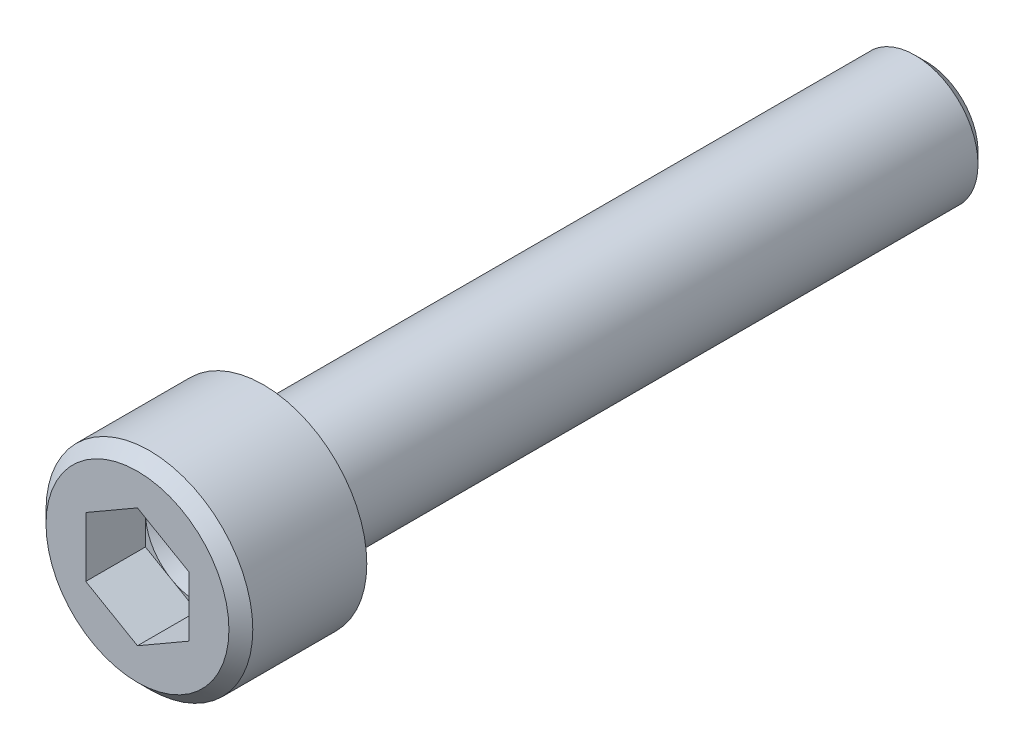
ISO-10303-21;
HEADER;
FILE_DESCRIPTION(('STEP AP214'),'2;1');
FILE_NAME('part.step','',(''),(''),'','','');
FILE_SCHEMA(('AUTOMOTIVE_DESIGN { 1 0 10303 214 1 1 1 1 }'));
ENDSEC;
DATA;
#1=APPLICATION_CONTEXT('core data for automotive mechanical design processes');
#2=APPLICATION_PROTOCOL_DEFINITION('international standard','automotive_design',2000,#1);
#3=PRODUCT_CONTEXT('',#1,'mechanical');
#4=PRODUCT('Part','Part','',(#3));
#5=PRODUCT_RELATED_PRODUCT_CATEGORY('part','',(#4));
#6=PRODUCT_DEFINITION_FORMATION('','',#4);
#7=PRODUCT_DEFINITION_CONTEXT('part definition',#1,'design');
#8=PRODUCT_DEFINITION('design','',#6,#7);
#9=PRODUCT_DEFINITION_SHAPE('','',#8);
#10=(LENGTH_UNIT() NAMED_UNIT(*) SI_UNIT(.MILLI.,.METRE.));
#11=(NAMED_UNIT(*) PLANE_ANGLE_UNIT() SI_UNIT($,.RADIAN.));
#12=(NAMED_UNIT(*) SI_UNIT($,.STERADIAN.) SOLID_ANGLE_UNIT());
#13=UNCERTAINTY_MEASURE_WITH_UNIT(LENGTH_MEASURE(1.E-05),#10,'distance_accuracy_value','');
#14=(GEOMETRIC_REPRESENTATION_CONTEXT(3) GLOBAL_UNCERTAINTY_ASSIGNED_CONTEXT((#13)) GLOBAL_UNIT_ASSIGNED_CONTEXT((#10,
#11,#12)) REPRESENTATION_CONTEXT('',''));
#15=CARTESIAN_POINT('',(0.,0.,0.));
#16=DIRECTION('',(0.,0.,1.));
#17=DIRECTION('',(1.,0.,0.));
#18=AXIS2_PLACEMENT_3D('',#15,#16,#17);
#19=CARTESIAN_POINT('',(0.,0.,2.54));
#20=DIRECTION('',(0.,0.,1.));
#21=DIRECTION('',(1.,0.,0.));
#22=AXIS2_PLACEMENT_3D('',#19,#20,#21);
#23=PLANE('',#22);
#24=DIRECTION('',(0.,1.,0.));
#25=VECTOR('',#24,1.);
#26=CARTESIAN_POINT('',(-1.9812,0.,2.54));
#27=LINE('',#26,#25);
#28=CARTESIAN_POINT('',(-1.9812,0.,2.54));
#29=VERTEX_POINT('',#28);
#30=CARTESIAN_POINT('',(-1.9812,1.14384635331848,2.54));
#31=VERTEX_POINT('',#30);
#32=EDGE_CURVE('E398',#29,#31,#27,.T.);
#33=ORIENTED_EDGE('',*,*,#32,.F.);
#34=CARTESIAN_POINT('',(0.,0.,2.54));
#35=DIRECTION('',(0.,0.,-1.));
#36=DIRECTION('',(-1.,0.,0.));
#37=AXIS2_PLACEMENT_3D('',#34,#35,#36);
#38=CIRCLE('',#37,1.9812);
#39=CARTESIAN_POINT('',(-0.9906,1.71576952997773,2.54));
#40=VERTEX_POINT('',#39);
#41=EDGE_CURVE('E33',#29,#40,#38,.T.);
#42=ORIENTED_EDGE('',*,*,#41,.T.);
#43=DIRECTION('',(0.866025403784439,0.5,0.));
#44=VECTOR('',#43,1.);
#45=CARTESIAN_POINT('',(0.163354175866616,2.38200528404682,2.54));
#46=LINE('',#45,#44);
#47=EDGE_CURVE('E393',#31,#40,#46,.T.);
#48=ORIENTED_EDGE('',*,*,#47,.F.);
#49=EDGE_LOOP('',(#33,#42,#48));
#50=FACE_BOUND('',#49,.T.);
#51=ADVANCED_FACE('F17',(#50),#23,.T.);
#52=CARTESIAN_POINT('',(0.,2.28769270663697,2.54));
#53=VERTEX_POINT('',#52);
#54=EDGE_CURVE('E391',#40,#53,#46,.T.);
#55=ORIENTED_EDGE('',*,*,#54,.F.);
#56=CARTESIAN_POINT('',(0.9906,1.71576952997773,2.54));
#57=VERTEX_POINT('',#56);
#58=EDGE_CURVE('E224',#40,#57,#38,.T.);
#59=ORIENTED_EDGE('',*,*,#58,.T.);
#60=DIRECTION('',(0.866025403784439,-0.5,0.));
#61=VECTOR('',#60,1.);
#62=CARTESIAN_POINT('',(-0.163354175866613,2.38200528404681,2.54));
#63=LINE('',#62,#61);
#64=EDGE_CURVE('E383',#53,#57,#63,.T.);
#65=ORIENTED_EDGE('',*,*,#64,.F.);
#66=EDGE_LOOP('',(#55,#59,#65));
#67=FACE_BOUND('',#66,.T.);
#68=ADVANCED_FACE('F105',(#67),#23,.T.);
#69=CARTESIAN_POINT('',(1.9812,1.14384635331849,2.54));
#70=VERTEX_POINT('',#69);
#71=EDGE_CURVE('E189',#57,#70,#63,.T.);
#72=ORIENTED_EDGE('',*,*,#71,.F.);
#73=CARTESIAN_POINT('',(1.9812,0.,2.54));
#74=VERTEX_POINT('',#73);
#75=EDGE_CURVE('E380',#57,#74,#38,.T.);
#76=ORIENTED_EDGE('',*,*,#75,.T.);
#77=DIRECTION('',(0.,-1.,0.));
#78=VECTOR('',#77,1.);
#79=CARTESIAN_POINT('',(1.9812,0.,2.54));
#80=LINE('',#79,#78);
#81=EDGE_CURVE('E160',#70,#74,#80,.T.);
#82=ORIENTED_EDGE('',*,*,#81,.F.);
#83=EDGE_LOOP('',(#72,#76,#82));
#84=FACE_BOUND('',#83,.T.);
#85=ADVANCED_FACE('F111',(#84),#23,.T.);
#86=CARTESIAN_POINT('',(1.9812,-1.14384635331849,2.54));
#87=VERTEX_POINT('',#86);
#88=EDGE_CURVE('E155',#74,#87,#80,.T.);
#89=ORIENTED_EDGE('',*,*,#88,.F.);
#90=CARTESIAN_POINT('',(0.9906,-1.71576952997773,2.54));
#91=VERTEX_POINT('',#90);
#92=EDGE_CURVE('E415',#74,#91,#38,.T.);
#93=ORIENTED_EDGE('',*,*,#92,.T.);
#94=DIRECTION('',(-0.866025403784438,-0.5,0.));
#95=VECTOR('',#94,1.);
#96=CARTESIAN_POINT('',(2.14455417586661,-1.04953377590865,2.54));
#97=LINE('',#96,#95);
#98=EDGE_CURVE('E148',#87,#91,#97,.T.);
#99=ORIENTED_EDGE('',*,*,#98,.F.);
#100=EDGE_LOOP('',(#89,#93,#99));
#101=FACE_BOUND('',#100,.T.);
#102=ADVANCED_FACE('F129',(#101),#23,.T.);
#103=CARTESIAN_POINT('',(0.,-2.28769270663697,2.54));
#104=VERTEX_POINT('',#103);
#105=EDGE_CURVE('E141',#91,#104,#97,.T.);
#106=ORIENTED_EDGE('',*,*,#105,.F.);
#107=CARTESIAN_POINT('',(-0.9906,-1.71576952997773,2.54));
#108=VERTEX_POINT('',#107);
#109=EDGE_CURVE('E143',#91,#108,#38,.T.);
#110=ORIENTED_EDGE('',*,*,#109,.T.);
#111=DIRECTION('',(-0.866025403784439,0.5,0.));
#112=VECTOR('',#111,1.);
#113=CARTESIAN_POINT('',(-2.14455417586661,-1.04953377590865,2.54));
#114=LINE('',#113,#112);
#115=EDGE_CURVE('E145',#104,#108,#114,.T.);
#116=ORIENTED_EDGE('',*,*,#115,.F.);
#117=EDGE_LOOP('',(#106,#110,#116));
#118=FACE_BOUND('',#117,.T.);
#119=ADVANCED_FACE('F119',(#118),#23,.T.);
#120=CARTESIAN_POINT('',(0.,0.,4.826));
#121=DIRECTION('',(0.,0.,1.));
#122=DIRECTION('',(1.,0.,0.));
#123=AXIS2_PLACEMENT_3D('',#120,#121,#122);
#124=PLANE('',#123);
#125=CARTESIAN_POINT('',(0.,0.,4.826));
#126=DIRECTION('',(0.,0.,1.));
#127=DIRECTION('',(1.,0.,0.));
#128=AXIS2_PLACEMENT_3D('',#125,#126,#127);
#129=CIRCLE('',#128,3.5052);
#130=CARTESIAN_POINT('',(3.5052,0.,4.826));
#131=VERTEX_POINT('',#130);
#132=EDGE_CURVE('E210',#131,#131,#129,.T.);
#133=ORIENTED_EDGE('',*,*,#132,.T.);
#134=EDGE_LOOP('',(#133));
#135=FACE_BOUND('',#134,.T.);
#136=DIRECTION('',(0.866025403784439,0.5,0.));
#137=VECTOR('',#136,1.);
#138=CARTESIAN_POINT('',(0.163354175866616,2.38200528404682,4.826));
#139=LINE('',#138,#137);
#140=CARTESIAN_POINT('',(-1.9812,1.14384635331848,4.826));
#141=VERTEX_POINT('',#140);
#142=CARTESIAN_POINT('',(0.,2.28769270663697,4.826));
#143=VERTEX_POINT('',#142);
#144=EDGE_CURVE('E172',#141,#143,#139,.T.);
#145=ORIENTED_EDGE('',*,*,#144,.T.);
#146=DIRECTION('',(0.866025403784439,-0.5,0.));
#147=VECTOR('',#146,1.);
#148=CARTESIAN_POINT('',(-0.163354175866613,2.38200528404681,4.826));
#149=LINE('',#148,#147);
#150=CARTESIAN_POINT('',(1.9812,1.14384635331849,4.826));
#151=VERTEX_POINT('',#150);
#152=EDGE_CURVE('E168',#143,#151,#149,.T.);
#153=ORIENTED_EDGE('',*,*,#152,.T.);
#154=DIRECTION('',(0.,-1.,0.));
#155=VECTOR('',#154,1.);
#156=CARTESIAN_POINT('',(1.9812,0.,4.826));
#157=LINE('',#156,#155);
#158=CARTESIAN_POINT('',(1.9812,-1.14384635331849,4.826));
#159=VERTEX_POINT('',#158);
#160=EDGE_CURVE('E185',#151,#159,#157,.T.);
#161=ORIENTED_EDGE('',*,*,#160,.T.);
#162=DIRECTION('',(-0.866025403784438,-0.5,0.));
#163=VECTOR('',#162,1.);
#164=CARTESIAN_POINT('',(2.14455417586661,-1.04953377590865,4.826));
#165=LINE('',#164,#163);
#166=CARTESIAN_POINT('',(0.,-2.28769270663697,4.826));
#167=VERTEX_POINT('',#166);
#168=EDGE_CURVE('E41',#159,#167,#165,.T.);
#169=ORIENTED_EDGE('',*,*,#168,.T.);
#170=DIRECTION('',(-0.866025403784439,0.5,0.));
#171=VECTOR('',#170,1.);
#172=CARTESIAN_POINT('',(-2.14455417586661,-1.04953377590865,4.826));
#173=LINE('',#172,#171);
#174=CARTESIAN_POINT('',(-1.9812,-1.14384635331849,4.826));
#175=VERTEX_POINT('',#174);
#176=EDGE_CURVE('E180',#167,#175,#173,.T.);
#177=ORIENTED_EDGE('',*,*,#176,.T.);
#178=DIRECTION('',(0.,1.,0.));
#179=VECTOR('',#178,1.);
#180=CARTESIAN_POINT('',(-1.9812,0.,4.826));
#181=LINE('',#180,#179);
#182=EDGE_CURVE('E176',#175,#141,#181,.T.);
#183=ORIENTED_EDGE('',*,*,#182,.T.);
#184=EDGE_LOOP('',(#145,#153,#161,#169,#177,#183));
#185=FACE_BOUND('',#184,.T.);
#186=ADVANCED_FACE('F128',(#135,#185),#124,.T.);
#187=CARTESIAN_POINT('',(0.,0.,4.826));
#188=DIRECTION('',(0.,0.,-1.));
#189=DIRECTION('',(-1.,0.,0.));
#190=AXIS2_PLACEMENT_3D('',#187,#188,#189);
#191=CYLINDRICAL_SURFACE('',#190,3.9624);
#192=CARTESIAN_POINT('',(0.,0.,4.3688));
#193=DIRECTION('',(0.,0.,1.));
#194=DIRECTION('',(1.,0.,0.));
#195=AXIS2_PLACEMENT_3D('',#192,#193,#194);
#196=CIRCLE('',#195,3.9624);
#197=CARTESIAN_POINT('',(3.9624,0.,4.3688));
#198=VERTEX_POINT('',#197);
#199=EDGE_CURVE('E214',#198,#198,#196,.F.);
#200=ORIENTED_EDGE('',*,*,#199,.T.);
#201=EDGE_LOOP('',(#200));
#202=FACE_BOUND('',#201,.T.);
#203=CARTESIAN_POINT('',(0.,0.,0.));
#204=DIRECTION('',(0.,0.,1.));
#205=DIRECTION('',(1.,0.,0.));
#206=AXIS2_PLACEMENT_3D('',#203,#204,#205);
#207=CIRCLE('',#206,3.9624);
#208=CARTESIAN_POINT('',(3.9624,0.,0.));
#209=VERTEX_POINT('',#208);
#210=EDGE_CURVE('E206',#209,#209,#207,.T.);
#211=ORIENTED_EDGE('',*,*,#210,.T.);
#212=EDGE_LOOP('',(#211));
#213=FACE_BOUND('',#212,.T.);
#214=ADVANCED_FACE('F134',(#202,#213),#191,.T.);
#215=CARTESIAN_POINT('',(0.,0.,0.));
#216=DIRECTION('',(0.,0.,1.));
#217=DIRECTION('',(1.,0.,0.));
#218=AXIS2_PLACEMENT_3D('',#215,#216,#217);
#219=PLANE('',#218);
#220=CARTESIAN_POINT('',(0.,0.,0.));
#221=DIRECTION('',(0.,0.,1.));
#222=DIRECTION('',(1.,0.,0.));
#223=AXIS2_PLACEMENT_3D('',#220,#221,#222);
#224=CIRCLE('',#223,2.5654);
#225=CARTESIAN_POINT('',(2.5654,0.,0.));
#226=VERTEX_POINT('',#225);
#227=EDGE_CURVE('E223',#226,#226,#224,.T.);
#228=ORIENTED_EDGE('',*,*,#227,.T.);
#229=EDGE_LOOP('',(#228));
#230=FACE_BOUND('',#229,.T.);
#231=ORIENTED_EDGE('',*,*,#210,.F.);
#232=EDGE_LOOP('',(#231));
#233=FACE_BOUND('',#232,.T.);
#234=ADVANCED_FACE('F324',(#230,#233),#219,.F.);
#235=CARTESIAN_POINT('',(0.,0.,4.826));
#236=DIRECTION('',(0.,0.,-1.));
#237=DIRECTION('',(-1.,0.,0.));
#238=AXIS2_PLACEMENT_3D('',#235,#236,#237);
#239=CONICAL_SURFACE('',#238,3.5052,0.785398163397449);
#240=ORIENTED_EDGE('',*,*,#199,.F.);
#241=EDGE_LOOP('',(#240));
#242=FACE_BOUND('',#241,.T.);
#243=ORIENTED_EDGE('',*,*,#132,.F.);
#244=EDGE_LOOP('',(#243));
#245=FACE_BOUND('',#244,.T.);
#246=ADVANCED_FACE('F315',(#242,#245),#239,.T.);
#247=CARTESIAN_POINT('',(-0.163354175866613,2.38200528404681,2.54));
#248=DIRECTION('',(-0.5,-0.866025403784439,0.));
#249=DIRECTION('',(0.866025403784439,-0.5,0.));
#250=AXIS2_PLACEMENT_3D('',#247,#248,#249);
#251=PLANE('',#250);
#252=ORIENTED_EDGE('',*,*,#152,.F.);
#253=DIRECTION('',(0.,0.,1.));
#254=VECTOR('',#253,1.);
#255=CARTESIAN_POINT('',(0.,2.28769270663697,2.54));
#256=LINE('',#255,#254);
#257=EDGE_CURVE('E203',#53,#143,#256,.T.);
#258=ORIENTED_EDGE('',*,*,#257,.F.);
#259=ORIENTED_EDGE('',*,*,#64,.T.);
#260=ORIENTED_EDGE('',*,*,#71,.T.);
#261=DIRECTION('',(0.,0.,1.));
#262=VECTOR('',#261,1.);
#263=CARTESIAN_POINT('',(1.9812,1.14384635331849,2.54));
#264=LINE('',#263,#262);
#265=EDGE_CURVE('E167',#70,#151,#264,.T.);
#266=ORIENTED_EDGE('',*,*,#265,.T.);
#267=EDGE_LOOP('',(#252,#258,#259,#260,#266));
#268=FACE_BOUND('',#267,.T.);
#269=ADVANCED_FACE('F306',(#268),#251,.T.);
#270=CARTESIAN_POINT('',(0.163354175866616,2.38200528404682,2.54));
#271=DIRECTION('',(0.5,-0.866025403784438,0.));
#272=DIRECTION('',(0.866025403784438,0.5,0.));
#273=AXIS2_PLACEMENT_3D('',#270,#271,#272);
#274=PLANE('',#273);
#275=ORIENTED_EDGE('',*,*,#144,.F.);
#276=DIRECTION('',(0.,0.,1.));
#277=VECTOR('',#276,1.);
#278=CARTESIAN_POINT('',(-1.9812,1.14384635331848,2.54));
#279=LINE('',#278,#277);
#280=EDGE_CURVE('E200',#31,#141,#279,.T.);
#281=ORIENTED_EDGE('',*,*,#280,.F.);
#282=ORIENTED_EDGE('',*,*,#47,.T.);
#283=ORIENTED_EDGE('',*,*,#54,.T.);
#284=ORIENTED_EDGE('',*,*,#257,.T.);
#285=EDGE_LOOP('',(#275,#281,#282,#283,#284));
#286=FACE_BOUND('',#285,.T.);
#287=ADVANCED_FACE('F297',(#286),#274,.T.);
#288=CARTESIAN_POINT('',(-1.9812,0.,2.54));
#289=DIRECTION('',(1.,0.,0.));
#290=DIRECTION('',(0.,1.,0.));
#291=AXIS2_PLACEMENT_3D('',#288,#289,#290);
#292=PLANE('',#291);
#293=ORIENTED_EDGE('',*,*,#182,.F.);
#294=DIRECTION('',(0.,0.,1.));
#295=VECTOR('',#294,1.);
#296=CARTESIAN_POINT('',(-1.9812,-1.14384635331849,2.54));
#297=LINE('',#296,#295);
#298=CARTESIAN_POINT('',(-1.9812,-1.14384635331849,2.54));
#299=VERTEX_POINT('',#298);
#300=EDGE_CURVE('E197',#299,#175,#297,.T.);
#301=ORIENTED_EDGE('',*,*,#300,.F.);
#302=EDGE_CURVE('E399',#299,#29,#27,.T.);
#303=ORIENTED_EDGE('',*,*,#302,.T.);
#304=ORIENTED_EDGE('',*,*,#32,.T.);
#305=ORIENTED_EDGE('',*,*,#280,.T.);
#306=EDGE_LOOP('',(#293,#301,#303,#304,#305));
#307=FACE_BOUND('',#306,.T.);
#308=ADVANCED_FACE('F288',(#307),#292,.T.);
#309=CARTESIAN_POINT('',(-2.14455417586661,-1.04953377590865,2.54));
#310=DIRECTION('',(0.5,0.866025403784439,0.));
#311=DIRECTION('',(-0.866025403784439,0.5,0.));
#312=AXIS2_PLACEMENT_3D('',#309,#310,#311);
#313=PLANE('',#312);
#314=ORIENTED_EDGE('',*,*,#176,.F.);
#315=DIRECTION('',(0.,0.,1.));
#316=VECTOR('',#315,1.);
#317=CARTESIAN_POINT('',(0.,-2.28769270663697,2.54));
#318=LINE('',#317,#316);
#319=EDGE_CURVE('E194',#104,#167,#318,.T.);
#320=ORIENTED_EDGE('',*,*,#319,.F.);
#321=ORIENTED_EDGE('',*,*,#115,.T.);
#322=EDGE_CURVE('E401',#108,#299,#114,.T.);
#323=ORIENTED_EDGE('',*,*,#322,.T.);
#324=ORIENTED_EDGE('',*,*,#300,.T.);
#325=EDGE_LOOP('',(#314,#320,#321,#323,#324));
#326=FACE_BOUND('',#325,.T.);
#327=ADVANCED_FACE('F280',(#326),#313,.T.);
#328=CARTESIAN_POINT('',(2.14455417586661,-1.04953377590865,2.54));
#329=DIRECTION('',(-0.5,0.866025403784438,0.));
#330=DIRECTION('',(-0.866025403784438,-0.5,0.));
#331=AXIS2_PLACEMENT_3D('',#328,#329,#330);
#332=PLANE('',#331);
#333=ORIENTED_EDGE('',*,*,#168,.F.);
#334=DIRECTION('',(0.,0.,1.));
#335=VECTOR('',#334,1.);
#336=CARTESIAN_POINT('',(1.9812,-1.14384635331849,2.54));
#337=LINE('',#336,#335);
#338=EDGE_CURVE('E151',#87,#159,#337,.T.);
#339=ORIENTED_EDGE('',*,*,#338,.F.);
#340=ORIENTED_EDGE('',*,*,#98,.T.);
#341=ORIENTED_EDGE('',*,*,#105,.T.);
#342=ORIENTED_EDGE('',*,*,#319,.T.);
#343=EDGE_LOOP('',(#333,#339,#340,#341,#342));
#344=FACE_BOUND('',#343,.T.);
#345=ADVANCED_FACE('F124',(#344),#332,.T.);
#346=CARTESIAN_POINT('',(1.9812,0.,2.54));
#347=DIRECTION('',(-1.,0.,0.));
#348=DIRECTION('',(0.,-1.,0.));
#349=AXIS2_PLACEMENT_3D('',#346,#347,#348);
#350=PLANE('',#349);
#351=ORIENTED_EDGE('',*,*,#160,.F.);
#352=ORIENTED_EDGE('',*,*,#265,.F.);
#353=ORIENTED_EDGE('',*,*,#81,.T.);
#354=ORIENTED_EDGE('',*,*,#88,.T.);
#355=ORIENTED_EDGE('',*,*,#338,.T.);
#356=EDGE_LOOP('',(#351,#352,#353,#354,#355));
#357=FACE_BOUND('',#356,.T.);
#358=ADVANCED_FACE('F117',(#357),#350,.T.);
#359=ORIENTED_EDGE('',*,*,#322,.F.);
#360=EDGE_CURVE('E218',#108,#29,#38,.T.);
#361=ORIENTED_EDGE('',*,*,#360,.T.);
#362=ORIENTED_EDGE('',*,*,#302,.F.);
#363=EDGE_LOOP('',(#359,#361,#362));
#364=FACE_BOUND('',#363,.T.);
#365=ADVANCED_FACE('F108',(#364),#23,.T.);
#366=CARTESIAN_POINT('',(0.,0.,-25.4));
#367=DIRECTION('',(0.,0.,1.));
#368=DIRECTION('',(1.,0.,0.));
#369=AXIS2_PLACEMENT_3D('',#366,#367,#368);
#370=CYLINDRICAL_SURFACE('',#369,2.413);
#371=CARTESIAN_POINT('',(0.,0.,-24.97105761938));
#372=DIRECTION('',(0.,0.,-1.));
#373=DIRECTION('',(-1.,0.,0.));
#374=AXIS2_PLACEMENT_3D('',#371,#372,#373);
#375=CIRCLE('',#374,2.413);
#376=CARTESIAN_POINT('',(-2.413,0.,-24.97105761938));
#377=VERTEX_POINT('',#376);
#378=EDGE_CURVE('E11',#377,#377,#375,.F.);
#379=ORIENTED_EDGE('',*,*,#378,.T.);
#380=EDGE_LOOP('',(#379));
#381=FACE_BOUND('',#380,.T.);
#382=CARTESIAN_POINT('',(0.,0.,-0.1524));
#383=DIRECTION('',(0.,0.,1.));
#384=DIRECTION('',(1.,0.,0.));
#385=AXIS2_PLACEMENT_3D('',#382,#383,#384);
#386=CIRCLE('',#385,2.413);
#387=CARTESIAN_POINT('',(2.413,0.,-0.1524));
#388=VERTEX_POINT('',#387);
#389=EDGE_CURVE('E219',#388,#388,#386,.F.);
#390=ORIENTED_EDGE('',*,*,#389,.T.);
#391=EDGE_LOOP('',(#390));
#392=FACE_BOUND('',#391,.T.);
#393=ADVANCED_FACE('F101',(#381,#392),#370,.T.);
#394=CARTESIAN_POINT('',(0.,0.,-25.4));
#395=DIRECTION('',(0.,0.,-1.));
#396=DIRECTION('',(1.,0.,0.));
#397=AXIS2_PLACEMENT_3D('',#394,#395,#396);
#398=PLANE('',#397);
#399=CARTESIAN_POINT('',(0.,0.,-25.4));
#400=DIRECTION('',(0.,0.,-1.));
#401=DIRECTION('',(-1.,0.,0.));
#402=AXIS2_PLACEMENT_3D('',#399,#400,#401);
#403=CIRCLE('',#402,1.98405761938);
#404=CARTESIAN_POINT('',(-1.98405761938,0.,-25.4));
#405=VERTEX_POINT('',#404);
#406=EDGE_CURVE('E26',#405,#405,#403,.T.);
#407=ORIENTED_EDGE('',*,*,#406,.T.);
#408=EDGE_LOOP('',(#407));
#409=FACE_BOUND('',#408,.T.);
#410=ADVANCED_FACE('F94',(#409),#398,.T.);
#411=CARTESIAN_POINT('',(0.,0.,1.39615364668151));
#412=DIRECTION('',(0.,0.,1.));
#413=DIRECTION('',(1.,0.,0.));
#414=AXIS2_PLACEMENT_3D('',#411,#412,#413);
#415=CONICAL_SURFACE('',#414,0.,1.0471975511966);
#416=ORIENTED_EDGE('',*,*,#41,.F.);
#417=ORIENTED_EDGE('',*,*,#360,.F.);
#418=ORIENTED_EDGE('',*,*,#109,.F.);
#419=ORIENTED_EDGE('',*,*,#92,.F.);
#420=ORIENTED_EDGE('',*,*,#75,.F.);
#421=ORIENTED_EDGE('',*,*,#58,.F.);
#422=EDGE_LOOP('',(#416,#417,#418,#419,#420,#421));
#423=FACE_BOUND('',#422,.T.);
#424=CARTESIAN_POINT('',(0.,0.,1.39615364668151));
#425=VERTEX_POINT('',#424);
#426=VERTEX_LOOP('',#425);
#427=FACE_BOUND('',#426,.T.);
#428=ADVANCED_FACE('F91',(#423,#427),#415,.F.);
#429=CARTESIAN_POINT('',(0.,0.,-0.1524));
#430=DIRECTION('',(0.,0.,1.));
#431=DIRECTION('',(1.,0.,0.));
#432=AXIS2_PLACEMENT_3D('',#429,#430,#431);
#433=TOROIDAL_SURFACE('',#432,2.5654,0.1524);
#434=ORIENTED_EDGE('',*,*,#227,.F.);
#435=EDGE_LOOP('',(#434));
#436=FACE_BOUND('',#435,.T.);
#437=ORIENTED_EDGE('',*,*,#389,.F.);
#438=EDGE_LOOP('',(#437));
#439=FACE_BOUND('',#438,.T.);
#440=ADVANCED_FACE('F93',(#436,#439),#433,.F.);
#441=CARTESIAN_POINT('',(0.,0.,-25.4));
#442=DIRECTION('',(0.,0.,1.));
#443=DIRECTION('',(1.,0.,0.));
#444=AXIS2_PLACEMENT_3D('',#441,#442,#443);
#445=CONICAL_SURFACE('',#444,1.98405761938,0.785398163397449);
#446=ORIENTED_EDGE('',*,*,#378,.F.);
#447=EDGE_LOOP('',(#446));
#448=FACE_BOUND('',#447,.T.);
#449=ORIENTED_EDGE('',*,*,#406,.F.);
#450=EDGE_LOOP('',(#449));
#451=FACE_BOUND('',#450,.T.);
#452=ADVANCED_FACE('F19',(#448,#451),#445,.T.);
#453=CLOSED_SHELL('',(#51,#68,#85,#102,#119,#186,#214,#234,#246,#269,#287,#308,#327,#345,#358,
#365,#393,#410,#428,#440,#452));
#454=MANIFOLD_SOLID_BREP('B1',#453);
#455=ADVANCED_BREP_SHAPE_REPRESENTATION('',(#18,#454),#14);
#456=SHAPE_DEFINITION_REPRESENTATION(#9,#455);
ENDSEC;
END-ISO-10303-21;
